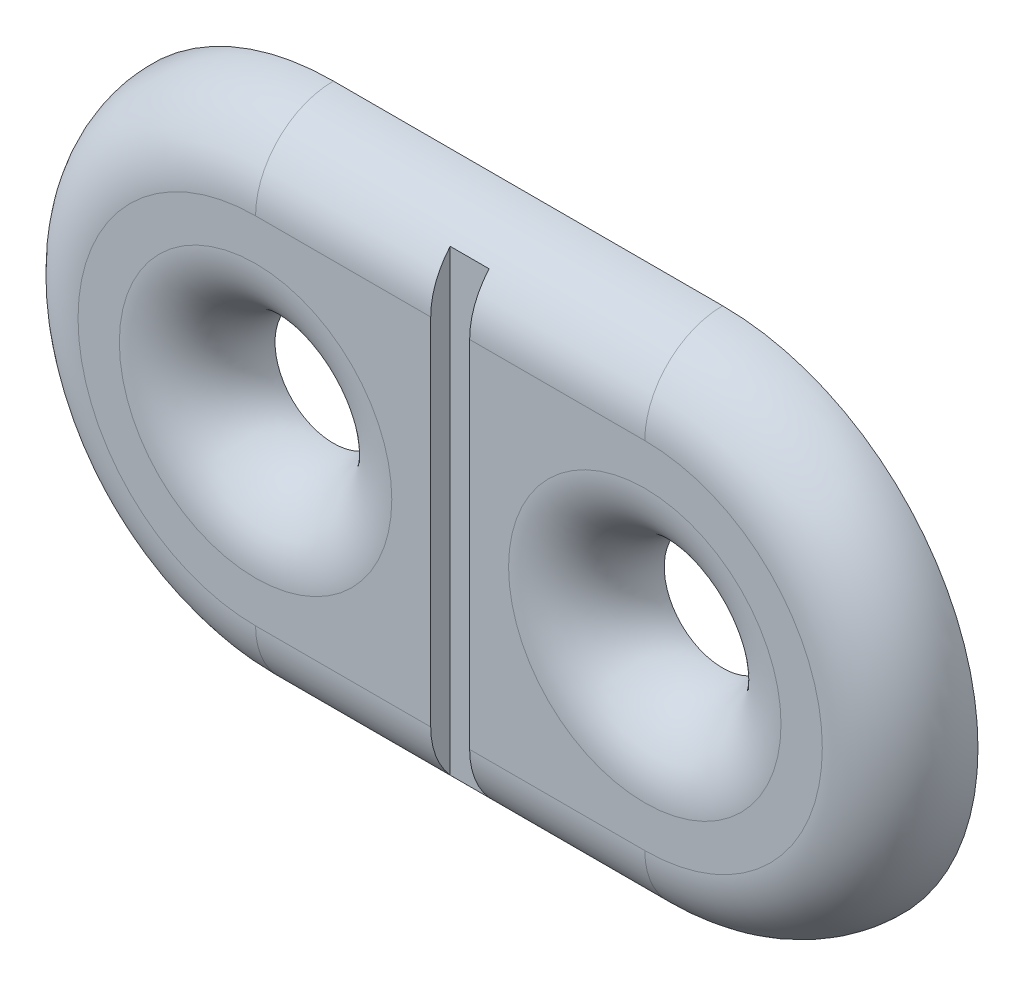
ISO-10303-21;
HEADER;
FILE_DESCRIPTION(('STEP AP214'),'2;1');
FILE_NAME('part.step','',(''),(''),'','','');
FILE_SCHEMA(('AUTOMOTIVE_DESIGN { 1 0 10303 214 1 1 1 1 }'));
ENDSEC;
DATA;
#1=APPLICATION_CONTEXT('core data for automotive mechanical design processes');
#2=APPLICATION_PROTOCOL_DEFINITION('international standard','automotive_design',2000,#1);
#3=PRODUCT_CONTEXT('',#1,'mechanical');
#4=PRODUCT('Part','Part','',(#3));
#5=PRODUCT_RELATED_PRODUCT_CATEGORY('part','',(#4));
#6=PRODUCT_DEFINITION_FORMATION('','',#4);
#7=PRODUCT_DEFINITION_CONTEXT('part definition',#1,'design');
#8=PRODUCT_DEFINITION('design','',#6,#7);
#9=PRODUCT_DEFINITION_SHAPE('','',#8);
#10=(LENGTH_UNIT() NAMED_UNIT(*) SI_UNIT(.MILLI.,.METRE.));
#11=(NAMED_UNIT(*) PLANE_ANGLE_UNIT() SI_UNIT($,.RADIAN.));
#12=(NAMED_UNIT(*) SI_UNIT($,.STERADIAN.) SOLID_ANGLE_UNIT());
#13=UNCERTAINTY_MEASURE_WITH_UNIT(LENGTH_MEASURE(1.E-05),#10,'distance_accuracy_value','');
#14=(GEOMETRIC_REPRESENTATION_CONTEXT(3) GLOBAL_UNCERTAINTY_ASSIGNED_CONTEXT((#13)) GLOBAL_UNIT_ASSIGNED_CONTEXT((#10,
#11,#12)) REPRESENTATION_CONTEXT('',''));
#15=CARTESIAN_POINT('',(0.,0.,0.));
#16=DIRECTION('',(0.,0.,1.));
#17=DIRECTION('',(1.,0.,0.));
#18=AXIS2_PLACEMENT_3D('',#15,#16,#17);
#19=CARTESIAN_POINT('',(0.,0.,2.));
#20=DIRECTION('',(0.,0.,1.));
#21=DIRECTION('',(1.,0.,0.));
#22=AXIS2_PLACEMENT_3D('',#19,#20,#21);
#23=PLANE('',#22);
#24=DIRECTION('',(0.,1.,0.));
#25=VECTOR('',#24,1.);
#26=CARTESIAN_POINT('',(5.5,0.,2.));
#27=LINE('',#26,#25);
#28=CARTESIAN_POINT('',(5.5,-4.56073983891999,2.));
#29=VERTEX_POINT('',#28);
#30=CARTESIAN_POINT('',(5.5,4.56073983891999,2.));
#31=VERTEX_POINT('',#30);
#32=EDGE_CURVE('E127',#29,#31,#27,.T.);
#33=ORIENTED_EDGE('',*,*,#32,.F.);
#34=DIRECTION('',(1.,0.,0.));
#35=VECTOR('',#34,1.);
#36=CARTESIAN_POINT('',(10.,-4.56073983891999,2.));
#37=LINE('',#36,#35);
#38=CARTESIAN_POINT('',(10.,-4.56073983891999,2.));
#39=VERTEX_POINT('',#38);
#40=EDGE_CURVE('E124',#29,#39,#37,.T.);
#41=ORIENTED_EDGE('',*,*,#40,.T.);
#42=CARTESIAN_POINT('',(10.,0.,2.));
#43=DIRECTION('',(0.,0.,1.));
#44=DIRECTION('',(1.,0.,0.));
#45=AXIS2_PLACEMENT_3D('',#42,#43,#44);
#46=CIRCLE('',#45,4.56073983891999);
#47=CARTESIAN_POINT('',(10.,4.56073983891999,2.));
#48=VERTEX_POINT('',#47);
#49=EDGE_CURVE('E61',#39,#48,#46,.T.);
#50=ORIENTED_EDGE('',*,*,#49,.T.);
#51=DIRECTION('',(-1.,0.,0.));
#52=VECTOR('',#51,1.);
#53=CARTESIAN_POINT('',(0.,4.56073983891999,2.));
#54=LINE('',#53,#52);
#55=EDGE_CURVE('E177',#48,#31,#54,.T.);
#56=ORIENTED_EDGE('',*,*,#55,.T.);
#57=EDGE_LOOP('',(#33,#41,#50,#56));
#58=FACE_BOUND('',#57,.T.);
#59=CARTESIAN_POINT('',(10.,0.,2.));
#60=DIRECTION('',(0.,0.,1.));
#61=DIRECTION('',(1.,0.,0.));
#62=AXIS2_PLACEMENT_3D('',#59,#60,#61);
#63=CIRCLE('',#62,3.5);
#64=CARTESIAN_POINT('',(13.5,0.,2.));
#65=VERTEX_POINT('',#64);
#66=EDGE_CURVE('E180',#65,#65,#63,.F.);
#67=ORIENTED_EDGE('',*,*,#66,.T.);
#68=EDGE_LOOP('',(#67));
#69=FACE_BOUND('',#68,.T.);
#70=ADVANCED_FACE('F38',(#58,#69),#23,.T.);
#71=DIRECTION('',(0.,-1.,0.));
#72=VECTOR('',#71,1.);
#73=CARTESIAN_POINT('',(4.5,0.,2.));
#74=LINE('',#73,#72);
#75=CARTESIAN_POINT('',(4.5,4.56073983891999,2.));
#76=VERTEX_POINT('',#75);
#77=CARTESIAN_POINT('',(4.5,-4.56073983891999,2.));
#78=VERTEX_POINT('',#77);
#79=EDGE_CURVE('E111',#76,#78,#74,.T.);
#80=ORIENTED_EDGE('',*,*,#79,.F.);
#81=CARTESIAN_POINT('',(0.,4.56073983891999,2.));
#82=VERTEX_POINT('',#81);
#83=EDGE_CURVE('E176',#76,#82,#54,.T.);
#84=ORIENTED_EDGE('',*,*,#83,.T.);
#85=CARTESIAN_POINT('',(0.,0.,2.));
#86=DIRECTION('',(0.,0.,1.));
#87=DIRECTION('',(1.,0.,0.));
#88=AXIS2_PLACEMENT_3D('',#85,#86,#87);
#89=CIRCLE('',#88,4.56073983891999);
#90=CARTESIAN_POINT('',(0.,-4.56073983891999,2.));
#91=VERTEX_POINT('',#90);
#92=EDGE_CURVE('E167',#82,#91,#89,.T.);
#93=ORIENTED_EDGE('',*,*,#92,.T.);
#94=EDGE_CURVE('E170',#91,#78,#37,.T.);
#95=ORIENTED_EDGE('',*,*,#94,.T.);
#96=EDGE_LOOP('',(#80,#84,#93,#95));
#97=FACE_BOUND('',#96,.T.);
#98=CARTESIAN_POINT('',(0.,0.,2.));
#99=DIRECTION('',(0.,0.,1.));
#100=DIRECTION('',(1.,0.,0.));
#101=AXIS2_PLACEMENT_3D('',#98,#99,#100);
#102=CIRCLE('',#101,3.5);
#103=CARTESIAN_POINT('',(3.5,0.,2.));
#104=VERTEX_POINT('',#103);
#105=EDGE_CURVE('E163',#104,#104,#102,.F.);
#106=ORIENTED_EDGE('',*,*,#105,.T.);
#107=EDGE_LOOP('',(#106));
#108=FACE_BOUND('',#107,.T.);
#109=ADVANCED_FACE('F203',(#97,#108),#23,.T.);
#110=CARTESIAN_POINT('',(0.,0.,0.));
#111=DIRECTION('',(0.,0.,1.));
#112=DIRECTION('',(1.,0.,0.));
#113=AXIS2_PLACEMENT_3D('',#110,#111,#112);
#114=PLANE('',#113);
#115=CARTESIAN_POINT('',(0.,0.,0.));
#116=DIRECTION('',(0.,0.,1.));
#117=DIRECTION('',(1.,0.,0.));
#118=AXIS2_PLACEMENT_3D('',#115,#116,#117);
#119=CIRCLE('',#118,6.56073983891999);
#120=CARTESIAN_POINT('',(0.,6.56073983891999,0.));
#121=VERTEX_POINT('',#120);
#122=CARTESIAN_POINT('',(0.,-6.56073983891999,0.));
#123=VERTEX_POINT('',#122);
#124=EDGE_CURVE('E147',#121,#123,#119,.T.);
#125=ORIENTED_EDGE('',*,*,#124,.F.);
#126=DIRECTION('',(-1.,0.,0.));
#127=VECTOR('',#126,1.);
#128=CARTESIAN_POINT('',(0.,6.56073983891999,0.));
#129=LINE('',#128,#127);
#130=CARTESIAN_POINT('',(10.,6.56073983891999,0.));
#131=VERTEX_POINT('',#130);
#132=EDGE_CURVE('E159',#131,#121,#129,.T.);
#133=ORIENTED_EDGE('',*,*,#132,.F.);
#134=CARTESIAN_POINT('',(10.,0.,0.));
#135=DIRECTION('',(0.,0.,1.));
#136=DIRECTION('',(1.,0.,0.));
#137=AXIS2_PLACEMENT_3D('',#134,#135,#136);
#138=CIRCLE('',#137,6.56073983891999);
#139=CARTESIAN_POINT('',(10.,-6.56073983891999,0.));
#140=VERTEX_POINT('',#139);
#141=EDGE_CURVE('E155',#140,#131,#138,.T.);
#142=ORIENTED_EDGE('',*,*,#141,.F.);
#143=DIRECTION('',(1.,0.,0.));
#144=VECTOR('',#143,1.);
#145=CARTESIAN_POINT('',(0.,-6.56073983891999,0.));
#146=LINE('',#145,#144);
#147=EDGE_CURVE('E151',#123,#140,#146,.T.);
#148=ORIENTED_EDGE('',*,*,#147,.F.);
#149=EDGE_LOOP('',(#125,#133,#142,#148));
#150=FACE_BOUND('',#149,.T.);
#151=CARTESIAN_POINT('',(0.,0.,0.));
#152=DIRECTION('',(0.,0.,1.));
#153=DIRECTION('',(1.,0.,0.));
#154=AXIS2_PLACEMENT_3D('',#151,#152,#153);
#155=CIRCLE('',#154,1.5);
#156=CARTESIAN_POINT('',(1.5,0.,0.));
#157=VERTEX_POINT('',#156);
#158=EDGE_CURVE('E142',#157,#157,#155,.T.);
#159=ORIENTED_EDGE('',*,*,#158,.T.);
#160=EDGE_LOOP('',(#159));
#161=FACE_BOUND('',#160,.T.);
#162=CARTESIAN_POINT('',(10.,0.,0.));
#163=DIRECTION('',(0.,0.,1.));
#164=DIRECTION('',(1.,0.,0.));
#165=AXIS2_PLACEMENT_3D('',#162,#163,#164);
#166=CIRCLE('',#165,1.5);
#167=CARTESIAN_POINT('',(11.5,0.,0.));
#168=VERTEX_POINT('',#167);
#169=EDGE_CURVE('E138',#168,#168,#166,.T.);
#170=ORIENTED_EDGE('',*,*,#169,.T.);
#171=EDGE_LOOP('',(#170));
#172=FACE_BOUND('',#171,.T.);
#173=ADVANCED_FACE('F225',(#150,#161,#172),#114,.F.);
#174=CARTESIAN_POINT('',(10.,0.,0.));
#175=DIRECTION('',(0.,0.,1.));
#176=DIRECTION('',(1.,0.,0.));
#177=AXIS2_PLACEMENT_3D('',#174,#175,#176);
#178=TOROIDAL_SURFACE('',#177,3.5,2.);
#179=ORIENTED_EDGE('',*,*,#66,.F.);
#180=EDGE_LOOP('',(#179));
#181=FACE_BOUND('',#180,.T.);
#182=ORIENTED_EDGE('',*,*,#169,.F.);
#183=EDGE_LOOP('',(#182));
#184=FACE_BOUND('',#183,.T.);
#185=ADVANCED_FACE('F228',(#181,#184),#178,.T.);
#186=CARTESIAN_POINT('',(0.,-4.56073983891999,0.));
#187=DIRECTION('',(-1.,0.,0.));
#188=DIRECTION('',(0.,0.,1.));
#189=AXIS2_PLACEMENT_3D('',#186,#187,#188);
#190=CYLINDRICAL_SURFACE('',#189,2.);
#191=CARTESIAN_POINT('',(5.5,-4.56073983891999,0.));
#192=DIRECTION('',(1.,0.,0.));
#193=DIRECTION('',(0.,0.,-1.));
#194=AXIS2_PLACEMENT_3D('',#191,#192,#193);
#195=CIRCLE('',#194,2.);
#196=CARTESIAN_POINT('',(5.5,-5.88361549445228,1.5));
#197=VERTEX_POINT('',#196);
#198=EDGE_CURVE('E115',#197,#29,#195,.F.);
#199=ORIENTED_EDGE('',*,*,#198,.F.);
#200=DIRECTION('',(-1.,0.,0.));
#201=VECTOR('',#200,1.);
#202=CARTESIAN_POINT('',(0.,-5.88361549445228,1.5));
#203=LINE('',#202,#201);
#204=CARTESIAN_POINT('',(4.5,-5.88361549445228,1.5));
#205=VERTEX_POINT('',#204);
#206=EDGE_CURVE('E103',#205,#197,#203,.F.);
#207=ORIENTED_EDGE('',*,*,#206,.F.);
#208=CARTESIAN_POINT('',(4.5,-4.56073983891999,0.));
#209=DIRECTION('',(-1.,0.,0.));
#210=DIRECTION('',(0.,0.,1.));
#211=AXIS2_PLACEMENT_3D('',#208,#209,#210);
#212=CIRCLE('',#211,2.);
#213=EDGE_CURVE('E134',#78,#205,#212,.F.);
#214=ORIENTED_EDGE('',*,*,#213,.F.);
#215=ORIENTED_EDGE('',*,*,#94,.F.);
#216=CARTESIAN_POINT('',(0.,-4.56073983891999,0.));
#217=DIRECTION('',(-1.,0.,0.));
#218=DIRECTION('',(0.,0.,1.));
#219=AXIS2_PLACEMENT_3D('',#216,#217,#218);
#220=CIRCLE('',#219,2.);
#221=EDGE_CURVE('E187',#123,#91,#220,.T.);
#222=ORIENTED_EDGE('',*,*,#221,.F.);
#223=ORIENTED_EDGE('',*,*,#147,.T.);
#224=CARTESIAN_POINT('',(10.,-4.56073983891999,0.));
#225=DIRECTION('',(1.,0.,0.));
#226=DIRECTION('',(0.,0.,-1.));
#227=AXIS2_PLACEMENT_3D('',#224,#225,#226);
#228=CIRCLE('',#227,2.);
#229=EDGE_CURVE('E143',#39,#140,#228,.T.);
#230=ORIENTED_EDGE('',*,*,#229,.F.);
#231=ORIENTED_EDGE('',*,*,#40,.F.);
#232=EDGE_LOOP('',(#199,#207,#214,#215,#222,#223,#230,#231));
#233=FACE_BOUND('',#232,.T.);
#234=ADVANCED_FACE('F122',(#233),#190,.T.);
#235=CARTESIAN_POINT('',(10.,0.,0.));
#236=DIRECTION('',(0.,0.,1.));
#237=DIRECTION('',(1.,0.,0.));
#238=AXIS2_PLACEMENT_3D('',#235,#236,#237);
#239=TOROIDAL_SURFACE('',#238,4.56073983891999,2.);
#240=ORIENTED_EDGE('',*,*,#229,.T.);
#241=ORIENTED_EDGE('',*,*,#141,.T.);
#242=CARTESIAN_POINT('',(10.,4.56073983891999,0.));
#243=DIRECTION('',(-1.,0.,0.));
#244=DIRECTION('',(0.,0.,1.));
#245=AXIS2_PLACEMENT_3D('',#242,#243,#244);
#246=CIRCLE('',#245,2.);
#247=EDGE_CURVE('E132',#48,#131,#246,.T.);
#248=ORIENTED_EDGE('',*,*,#247,.F.);
#249=ORIENTED_EDGE('',*,*,#49,.F.);
#250=EDGE_LOOP('',(#240,#241,#248,#249));
#251=FACE_BOUND('',#250,.T.);
#252=ADVANCED_FACE('F216',(#251),#239,.T.);
#253=CARTESIAN_POINT('',(0.,0.,0.));
#254=DIRECTION('',(0.,0.,1.));
#255=DIRECTION('',(1.,0.,0.));
#256=AXIS2_PLACEMENT_3D('',#253,#254,#255);
#257=TOROIDAL_SURFACE('',#256,4.56073983891999,2.);
#258=ORIENTED_EDGE('',*,*,#221,.T.);
#259=ORIENTED_EDGE('',*,*,#92,.F.);
#260=CARTESIAN_POINT('',(0.,4.56073983891999,0.));
#261=DIRECTION('',(1.,0.,0.));
#262=DIRECTION('',(0.,0.,-1.));
#263=AXIS2_PLACEMENT_3D('',#260,#261,#262);
#264=CIRCLE('',#263,2.);
#265=EDGE_CURVE('E126',#121,#82,#264,.T.);
#266=ORIENTED_EDGE('',*,*,#265,.F.);
#267=ORIENTED_EDGE('',*,*,#124,.T.);
#268=EDGE_LOOP('',(#258,#259,#266,#267));
#269=FACE_BOUND('',#268,.T.);
#270=ADVANCED_FACE('F221',(#269),#257,.T.);
#271=CARTESIAN_POINT('',(0.,4.56073983891999,0.));
#272=DIRECTION('',(1.,0.,0.));
#273=DIRECTION('',(0.,0.,-1.));
#274=AXIS2_PLACEMENT_3D('',#271,#272,#273);
#275=CYLINDRICAL_SURFACE('',#274,2.);
#276=CARTESIAN_POINT('',(5.5,4.56073983891999,0.));
#277=DIRECTION('',(1.,0.,0.));
#278=DIRECTION('',(0.,0.,-1.));
#279=AXIS2_PLACEMENT_3D('',#276,#277,#278);
#280=CIRCLE('',#279,2.);
#281=CARTESIAN_POINT('',(5.5,5.88361549445228,1.5));
#282=VERTEX_POINT('',#281);
#283=EDGE_CURVE('E11',#31,#282,#280,.F.);
#284=ORIENTED_EDGE('',*,*,#283,.F.);
#285=ORIENTED_EDGE('',*,*,#55,.F.);
#286=ORIENTED_EDGE('',*,*,#247,.T.);
#287=ORIENTED_EDGE('',*,*,#132,.T.);
#288=ORIENTED_EDGE('',*,*,#265,.T.);
#289=ORIENTED_EDGE('',*,*,#83,.F.);
#290=CARTESIAN_POINT('',(4.5,4.56073983891999,0.));
#291=DIRECTION('',(-1.,0.,0.));
#292=DIRECTION('',(0.,0.,1.));
#293=AXIS2_PLACEMENT_3D('',#290,#291,#292);
#294=CIRCLE('',#293,2.);
#295=CARTESIAN_POINT('',(4.5,5.88361549445228,1.5));
#296=VERTEX_POINT('',#295);
#297=EDGE_CURVE('E47',#296,#76,#294,.F.);
#298=ORIENTED_EDGE('',*,*,#297,.F.);
#299=DIRECTION('',(1.,0.,0.));
#300=VECTOR('',#299,1.);
#301=CARTESIAN_POINT('',(0.,5.88361549445228,1.5));
#302=LINE('',#301,#300);
#303=EDGE_CURVE('E183',#282,#296,#302,.F.);
#304=ORIENTED_EDGE('',*,*,#303,.F.);
#305=EDGE_LOOP('',(#284,#285,#286,#287,#288,#289,#298,#304));
#306=FACE_BOUND('',#305,.T.);
#307=ADVANCED_FACE('F208',(#306),#275,.T.);
#308=CARTESIAN_POINT('',(0.,0.,0.));
#309=DIRECTION('',(0.,0.,1.));
#310=DIRECTION('',(1.,0.,0.));
#311=AXIS2_PLACEMENT_3D('',#308,#309,#310);
#312=TOROIDAL_SURFACE('',#311,3.5,2.);
#313=ORIENTED_EDGE('',*,*,#105,.F.);
#314=EDGE_LOOP('',(#313));
#315=FACE_BOUND('',#314,.T.);
#316=ORIENTED_EDGE('',*,*,#158,.F.);
#317=EDGE_LOOP('',(#316));
#318=FACE_BOUND('',#317,.T.);
#319=ADVANCED_FACE('F40',(#315,#318),#312,.T.);
#320=CARTESIAN_POINT('',(5.5,-50.,2.5));
#321=DIRECTION('',(1.,0.,0.));
#322=DIRECTION('',(0.,0.,-1.));
#323=AXIS2_PLACEMENT_3D('',#320,#321,#322);
#324=PLANE('',#323);
#325=ORIENTED_EDGE('',*,*,#198,.T.);
#326=ORIENTED_EDGE('',*,*,#32,.T.);
#327=ORIENTED_EDGE('',*,*,#283,.T.);
#328=DIRECTION('',(0.,1.,0.));
#329=VECTOR('',#328,1.);
#330=CARTESIAN_POINT('',(5.5,-50.,1.5));
#331=LINE('',#330,#329);
#332=EDGE_CURVE('E54',#197,#282,#331,.T.);
#333=ORIENTED_EDGE('',*,*,#332,.F.);
#334=EDGE_LOOP('',(#325,#326,#327,#333));
#335=FACE_BOUND('',#334,.T.);
#336=ADVANCED_FACE('F114',(#335),#324,.F.);
#337=CARTESIAN_POINT('',(4.5,-50.,2.5));
#338=DIRECTION('',(-1.,0.,0.));
#339=DIRECTION('',(0.,0.,1.));
#340=AXIS2_PLACEMENT_3D('',#337,#338,#339);
#341=PLANE('',#340);
#342=ORIENTED_EDGE('',*,*,#213,.T.);
#343=DIRECTION('',(0.,1.,0.));
#344=VECTOR('',#343,1.);
#345=CARTESIAN_POINT('',(4.5,-50.,1.5));
#346=LINE('',#345,#344);
#347=EDGE_CURVE('E106',#205,#296,#346,.T.);
#348=ORIENTED_EDGE('',*,*,#347,.T.);
#349=ORIENTED_EDGE('',*,*,#297,.T.);
#350=ORIENTED_EDGE('',*,*,#79,.T.);
#351=EDGE_LOOP('',(#342,#348,#349,#350));
#352=FACE_BOUND('',#351,.T.);
#353=ADVANCED_FACE('F199',(#352),#341,.F.);
#354=CARTESIAN_POINT('',(4.5,-50.,1.5));
#355=DIRECTION('',(0.,0.,-1.));
#356=DIRECTION('',(-1.,0.,0.));
#357=AXIS2_PLACEMENT_3D('',#354,#355,#356);
#358=PLANE('',#357);
#359=ORIENTED_EDGE('',*,*,#206,.T.);
#360=ORIENTED_EDGE('',*,*,#332,.T.);
#361=ORIENTED_EDGE('',*,*,#303,.T.);
#362=ORIENTED_EDGE('',*,*,#347,.F.);
#363=EDGE_LOOP('',(#359,#360,#361,#362));
#364=FACE_BOUND('',#363,.T.);
#365=ADVANCED_FACE('F104',(#364),#358,.F.);
#366=CLOSED_SHELL('',(#70,#109,#173,#185,#234,#252,#270,#307,#319,#336,#353,#365));
#367=MANIFOLD_SOLID_BREP('B2',#366);
#368=ADVANCED_BREP_SHAPE_REPRESENTATION('',(#18,#367),#14);
#369=SHAPE_DEFINITION_REPRESENTATION(#9,#368);
ENDSEC;
END-ISO-10303-21;
